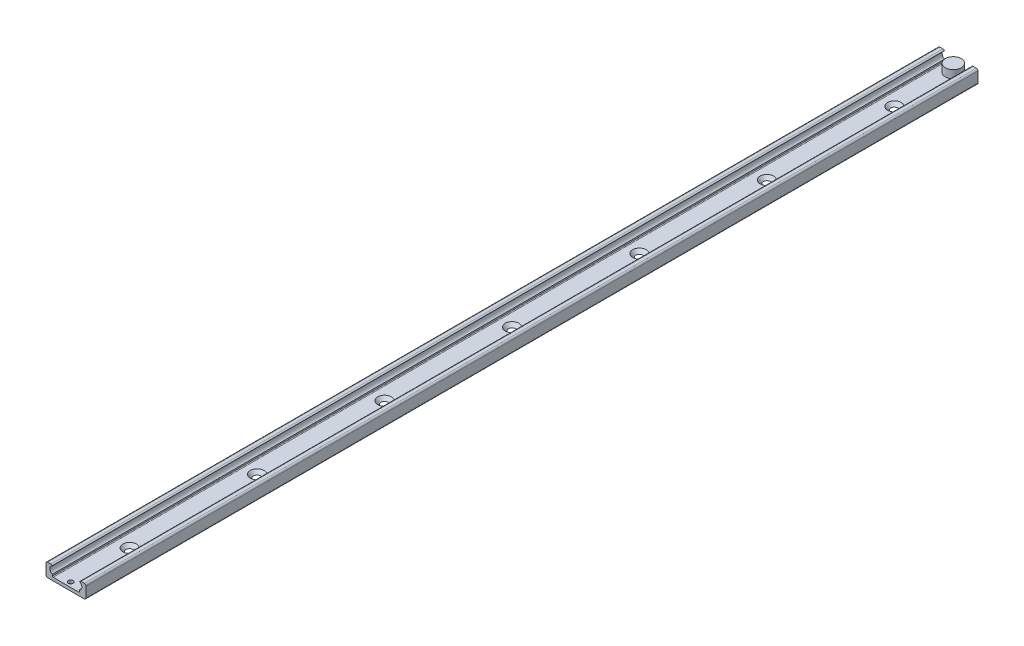
ISO-10303-21;
HEADER;
FILE_DESCRIPTION(('STEP AP214'),'2;1');
FILE_NAME('part.step','',(''),(''),'','','');
FILE_SCHEMA(('AUTOMOTIVE_DESIGN { 1 0 10303 214 1 1 1 1 }'));
ENDSEC;
DATA;
#1=APPLICATION_CONTEXT('core data for automotive mechanical design processes');
#2=APPLICATION_PROTOCOL_DEFINITION('international standard','automotive_design',2000,#1);
#3=PRODUCT_CONTEXT('',#1,'mechanical');
#4=PRODUCT('Part','Part','',(#3));
#5=PRODUCT_RELATED_PRODUCT_CATEGORY('part','',(#4));
#6=PRODUCT_DEFINITION_FORMATION('','',#4);
#7=PRODUCT_DEFINITION_CONTEXT('part definition',#1,'design');
#8=PRODUCT_DEFINITION('design','',#6,#7);
#9=PRODUCT_DEFINITION_SHAPE('','',#8);
#10=(LENGTH_UNIT() NAMED_UNIT(*) SI_UNIT(.MILLI.,.METRE.));
#11=(NAMED_UNIT(*) PLANE_ANGLE_UNIT() SI_UNIT($,.RADIAN.));
#12=(NAMED_UNIT(*) SI_UNIT($,.STERADIAN.) SOLID_ANGLE_UNIT());
#13=UNCERTAINTY_MEASURE_WITH_UNIT(LENGTH_MEASURE(1.E-05),#10,'distance_accuracy_value','');
#14=(GEOMETRIC_REPRESENTATION_CONTEXT(3) GLOBAL_UNCERTAINTY_ASSIGNED_CONTEXT((#13)) GLOBAL_UNIT_ASSIGNED_CONTEXT((#10,
#11,#12)) REPRESENTATION_CONTEXT('',''));
#15=CARTESIAN_POINT('',(0.,0.,0.));
#16=DIRECTION('',(0.,0.,1.));
#17=DIRECTION('',(1.,0.,0.));
#18=AXIS2_PLACEMENT_3D('',#15,#16,#17);
#19=CARTESIAN_POINT('',(-12.5,0.,0.));
#20=DIRECTION('',(0.,-1.,0.));
#21=DIRECTION('',(0.,0.,-1.));
#22=AXIS2_PLACEMENT_3D('',#19,#20,#21);
#23=PLANE('',#22);
#24=CARTESIAN_POINT('',(0.,0.,557.));
#25=DIRECTION('',(0.,1.,0.));
#26=DIRECTION('',(0.,0.,1.));
#27=AXIS2_PLACEMENT_3D('',#24,#25,#26);
#28=CIRCLE('',#27,1.5);
#29=CARTESIAN_POINT('',(0.,0.,558.5));
#30=VERTEX_POINT('',#29);
#31=EDGE_CURVE('E369',#30,#30,#28,.T.);
#32=ORIENTED_EDGE('',*,*,#31,.T.);
#33=EDGE_LOOP('',(#32));
#34=FACE_BOUND('',#33,.T.);
#35=DIRECTION('',(1.,0.,0.));
#36=VECTOR('',#35,1.);
#37=CARTESIAN_POINT('',(-14.285299108863,0.,560.));
#38=LINE('',#37,#36);
#39=CARTESIAN_POINT('',(-11.5000000000008,0.,560.));
#40=VERTEX_POINT('',#39);
#41=CARTESIAN_POINT('',(11.5000000000008,0.,560.));
#42=VERTEX_POINT('',#41);
#43=EDGE_CURVE('E367',#40,#42,#38,.T.);
#44=ORIENTED_EDGE('',*,*,#43,.F.);
#45=DIRECTION('',(0.,0.,1.));
#46=VECTOR('',#45,1.);
#47=CARTESIAN_POINT('',(-11.5000000000008,0.,0.));
#48=LINE('',#47,#46);
#49=CARTESIAN_POINT('',(-11.5000000000008,0.,0.));
#50=VERTEX_POINT('',#49);
#51=EDGE_CURVE('E232',#40,#50,#48,.F.);
#52=ORIENTED_EDGE('',*,*,#51,.T.);
#53=DIRECTION('',(1.,0.,0.));
#54=VECTOR('',#53,1.);
#55=CARTESIAN_POINT('',(-12.5,0.,0.));
#56=LINE('',#55,#54);
#57=CARTESIAN_POINT('',(11.5000000000008,0.,0.));
#58=VERTEX_POINT('',#57);
#59=EDGE_CURVE('E217',#50,#58,#56,.T.);
#60=ORIENTED_EDGE('',*,*,#59,.T.);
#61=DIRECTION('',(0.,0.,1.));
#62=VECTOR('',#61,1.);
#63=CARTESIAN_POINT('',(11.5000000000008,0.,0.));
#64=LINE('',#63,#62);
#65=EDGE_CURVE('E229',#58,#42,#64,.T.);
#66=ORIENTED_EDGE('',*,*,#65,.T.);
#67=EDGE_LOOP('',(#44,#52,#60,#66));
#68=FACE_BOUND('',#67,.T.);
#69=CARTESIAN_POINT('',(0.,0.,40.));
#70=DIRECTION('',(0.,1.,0.));
#71=DIRECTION('',(0.,0.,1.));
#72=AXIS2_PLACEMENT_3D('',#69,#70,#71);
#73=CIRCLE('',#72,2.25000000000002);
#74=CARTESIAN_POINT('',(0.,0.,42.25));
#75=VERTEX_POINT('',#74);
#76=EDGE_CURVE('E336',#75,#75,#73,.T.);
#77=ORIENTED_EDGE('',*,*,#76,.T.);
#78=EDGE_LOOP('',(#77));
#79=FACE_BOUND('',#78,.T.);
#80=CARTESIAN_POINT('',(0.,0.,120.));
#81=DIRECTION('',(0.,1.,0.));
#82=DIRECTION('',(0.,0.,1.));
#83=AXIS2_PLACEMENT_3D('',#80,#81,#82);
#84=CIRCLE('',#83,2.25000000000002);
#85=CARTESIAN_POINT('',(0.,0.,122.25));
#86=VERTEX_POINT('',#85);
#87=EDGE_CURVE('E300',#86,#86,#84,.T.);
#88=ORIENTED_EDGE('',*,*,#87,.T.);
#89=EDGE_LOOP('',(#88));
#90=FACE_BOUND('',#89,.T.);
#91=CARTESIAN_POINT('',(0.,0.,200.));
#92=DIRECTION('',(0.,1.,0.));
#93=DIRECTION('',(0.,0.,1.));
#94=AXIS2_PLACEMENT_3D('',#91,#92,#93);
#95=CIRCLE('',#94,2.25000000000002);
#96=CARTESIAN_POINT('',(0.,0.,202.25));
#97=VERTEX_POINT('',#96);
#98=EDGE_CURVE('E306',#97,#97,#95,.T.);
#99=ORIENTED_EDGE('',*,*,#98,.T.);
#100=EDGE_LOOP('',(#99));
#101=FACE_BOUND('',#100,.T.);
#102=CARTESIAN_POINT('',(0.,0.,280.));
#103=DIRECTION('',(0.,1.,0.));
#104=DIRECTION('',(0.,0.,1.));
#105=AXIS2_PLACEMENT_3D('',#102,#103,#104);
#106=CIRCLE('',#105,2.25000000000002);
#107=CARTESIAN_POINT('',(0.,0.,282.25));
#108=VERTEX_POINT('',#107);
#109=EDGE_CURVE('E312',#108,#108,#106,.T.);
#110=ORIENTED_EDGE('',*,*,#109,.T.);
#111=EDGE_LOOP('',(#110));
#112=FACE_BOUND('',#111,.T.);
#113=CARTESIAN_POINT('',(0.,0.,360.));
#114=DIRECTION('',(0.,1.,0.));
#115=DIRECTION('',(0.,0.,1.));
#116=AXIS2_PLACEMENT_3D('',#113,#114,#115);
#117=CIRCLE('',#116,2.25000000000002);
#118=CARTESIAN_POINT('',(0.,0.,362.25));
#119=VERTEX_POINT('',#118);
#120=EDGE_CURVE('E318',#119,#119,#117,.T.);
#121=ORIENTED_EDGE('',*,*,#120,.T.);
#122=EDGE_LOOP('',(#121));
#123=FACE_BOUND('',#122,.T.);
#124=CARTESIAN_POINT('',(0.,0.,440.));
#125=DIRECTION('',(0.,1.,0.));
#126=DIRECTION('',(0.,0.,1.));
#127=AXIS2_PLACEMENT_3D('',#124,#125,#126);
#128=CIRCLE('',#127,2.25000000000002);
#129=CARTESIAN_POINT('',(0.,0.,442.25));
#130=VERTEX_POINT('',#129);
#131=EDGE_CURVE('E324',#130,#130,#128,.T.);
#132=ORIENTED_EDGE('',*,*,#131,.T.);
#133=EDGE_LOOP('',(#132));
#134=FACE_BOUND('',#133,.T.);
#135=CARTESIAN_POINT('',(0.,0.,520.));
#136=DIRECTION('',(0.,1.,0.));
#137=DIRECTION('',(0.,0.,1.));
#138=AXIS2_PLACEMENT_3D('',#135,#136,#137);
#139=CIRCLE('',#138,2.25000000000002);
#140=CARTESIAN_POINT('',(0.,0.,522.25));
#141=VERTEX_POINT('',#140);
#142=EDGE_CURVE('E330',#141,#141,#139,.T.);
#143=ORIENTED_EDGE('',*,*,#142,.T.);
#144=EDGE_LOOP('',(#143));
#145=FACE_BOUND('',#144,.T.);
#146=ADVANCED_FACE('F39',(#34,#68,#79,#90,#101,#112,#123,#134,#145),#23,.T.);
#147=CARTESIAN_POINT('',(9.5,7.5,0.));
#148=DIRECTION('',(0.,0.,1.));
#149=DIRECTION('',(1.,0.,0.));
#150=AXIS2_PLACEMENT_3D('',#147,#148,#149);
#151=CYLINDRICAL_SURFACE('',#150,1.);
#152=CARTESIAN_POINT('',(9.5,7.5,560.));
#153=DIRECTION('',(0.,0.,-1.));
#154=DIRECTION('',(-1.,0.,0.));
#155=AXIS2_PLACEMENT_3D('',#152,#153,#154);
#156=CIRCLE('',#155,1.);
#157=CARTESIAN_POINT('',(9.5,8.5,560.));
#158=VERTEX_POINT('',#157);
#159=CARTESIAN_POINT('',(8.60359240331616,7.94323066298205,560.));
#160=VERTEX_POINT('',#159);
#161=EDGE_CURVE('E342',#158,#160,#156,.F.);
#162=ORIENTED_EDGE('',*,*,#161,.F.);
#163=DIRECTION('',(0.,0.,1.));
#164=VECTOR('',#163,1.);
#165=CARTESIAN_POINT('',(9.5,8.5,0.));
#166=LINE('',#165,#164);
#167=CARTESIAN_POINT('',(9.5,8.5,0.));
#168=VERTEX_POINT('',#167);
#169=EDGE_CURVE('E188',#168,#158,#166,.T.);
#170=ORIENTED_EDGE('',*,*,#169,.F.);
#171=CARTESIAN_POINT('',(9.5,7.5,0.));
#172=DIRECTION('',(0.,0.,1.));
#173=DIRECTION('',(1.,0.,0.));
#174=AXIS2_PLACEMENT_3D('',#171,#172,#173);
#175=CIRCLE('',#174,1.);
#176=CARTESIAN_POINT('',(8.60359240331616,7.94323066298205,0.));
#177=VERTEX_POINT('',#176);
#178=EDGE_CURVE('E290',#168,#177,#175,.T.);
#179=ORIENTED_EDGE('',*,*,#178,.T.);
#180=DIRECTION('',(0.,0.,1.));
#181=VECTOR('',#180,1.);
#182=CARTESIAN_POINT('',(8.60359240331616,7.94323066298205,0.));
#183=LINE('',#182,#181);
#184=EDGE_CURVE('E248',#177,#160,#183,.T.);
#185=ORIENTED_EDGE('',*,*,#184,.T.);
#186=EDGE_LOOP('',(#162,#170,#179,#185));
#187=FACE_BOUND('',#186,.T.);
#188=ADVANCED_FACE('F425',(#187),#151,.T.);
#189=CARTESIAN_POINT('',(12.5,8.5,0.));
#190=DIRECTION('',(0.,1.,0.));
#191=DIRECTION('',(0.,0.,1.));
#192=AXIS2_PLACEMENT_3D('',#189,#190,#191);
#193=PLANE('',#192);
#194=DIRECTION('',(-1.,0.,0.));
#195=VECTOR('',#194,1.);
#196=CARTESIAN_POINT('',(-14.285299108863,8.5,560.));
#197=LINE('',#196,#195);
#198=CARTESIAN_POINT('',(11.5000000000008,8.5,560.));
#199=VERTEX_POINT('',#198);
#200=EDGE_CURVE('E172',#199,#158,#197,.T.);
#201=ORIENTED_EDGE('',*,*,#200,.F.);
#202=DIRECTION('',(0.,0.,1.));
#203=VECTOR('',#202,1.);
#204=CARTESIAN_POINT('',(11.5000000000008,8.5,0.));
#205=LINE('',#204,#203);
#206=CARTESIAN_POINT('',(11.5000000000008,8.5,0.));
#207=VERTEX_POINT('',#206);
#208=EDGE_CURVE('E185',#199,#207,#205,.F.);
#209=ORIENTED_EDGE('',*,*,#208,.T.);
#210=DIRECTION('',(-1.,0.,0.));
#211=VECTOR('',#210,1.);
#212=CARTESIAN_POINT('',(12.5,8.5,0.));
#213=LINE('',#212,#211);
#214=EDGE_CURVE('E252',#207,#168,#213,.T.);
#215=ORIENTED_EDGE('',*,*,#214,.T.);
#216=ORIENTED_EDGE('',*,*,#169,.T.);
#217=EDGE_LOOP('',(#201,#209,#215,#216));
#218=FACE_BOUND('',#217,.T.);
#219=ADVANCED_FACE('F184',(#218),#193,.T.);
#220=CARTESIAN_POINT('',(12.5,0.,0.));
#221=DIRECTION('',(1.,0.,0.));
#222=DIRECTION('',(0.,0.,-1.));
#223=AXIS2_PLACEMENT_3D('',#220,#221,#222);
#224=PLANE('',#223);
#225=DIRECTION('',(0.,1.,0.));
#226=VECTOR('',#225,1.);
#227=CARTESIAN_POINT('',(12.5,0.,560.));
#228=LINE('',#227,#226);
#229=CARTESIAN_POINT('',(12.5,0.999999999999222,560.));
#230=VERTEX_POINT('',#229);
#231=CARTESIAN_POINT('',(12.5,7.50000000000078,560.));
#232=VERTEX_POINT('',#231);
#233=EDGE_CURVE('E175',#230,#232,#228,.T.);
#234=ORIENTED_EDGE('',*,*,#233,.F.);
#235=DIRECTION('',(0.,0.,1.));
#236=VECTOR('',#235,1.);
#237=CARTESIAN_POINT('',(12.5,0.999999999999222,0.));
#238=LINE('',#237,#236);
#239=CARTESIAN_POINT('',(12.5,0.999999999999222,0.));
#240=VERTEX_POINT('',#239);
#241=EDGE_CURVE('E223',#230,#240,#238,.F.);
#242=ORIENTED_EDGE('',*,*,#241,.T.);
#243=DIRECTION('',(0.,1.,0.));
#244=VECTOR('',#243,1.);
#245=CARTESIAN_POINT('',(12.5,0.,0.));
#246=LINE('',#245,#244);
#247=CARTESIAN_POINT('',(12.5,7.50000000000078,0.));
#248=VERTEX_POINT('',#247);
#249=EDGE_CURVE('E266',#240,#248,#246,.T.);
#250=ORIENTED_EDGE('',*,*,#249,.T.);
#251=DIRECTION('',(0.,0.,1.));
#252=VECTOR('',#251,1.);
#253=CARTESIAN_POINT('',(12.5,7.50000000000078,0.));
#254=LINE('',#253,#252);
#255=EDGE_CURVE('E227',#248,#232,#254,.T.);
#256=ORIENTED_EDGE('',*,*,#255,.T.);
#257=EDGE_LOOP('',(#234,#242,#250,#256));
#258=FACE_BOUND('',#257,.T.);
#259=ADVANCED_FACE('F435',(#258),#224,.T.);
#260=CARTESIAN_POINT('',(-12.5,8.5,0.));
#261=DIRECTION('',(-1.,0.,0.));
#262=DIRECTION('',(0.,0.,1.));
#263=AXIS2_PLACEMENT_3D('',#260,#261,#262);
#264=PLANE('',#263);
#265=DIRECTION('',(0.,-1.,0.));
#266=VECTOR('',#265,1.);
#267=CARTESIAN_POINT('',(-12.5,8.5,560.));
#268=LINE('',#267,#266);
#269=CARTESIAN_POINT('',(-12.5,7.50000000000078,560.));
#270=VERTEX_POINT('',#269);
#271=CARTESIAN_POINT('',(-12.5,0.999999999999222,560.));
#272=VERTEX_POINT('',#271);
#273=EDGE_CURVE('E53',#270,#272,#268,.T.);
#274=ORIENTED_EDGE('',*,*,#273,.F.);
#275=DIRECTION('',(0.,0.,1.));
#276=VECTOR('',#275,1.);
#277=CARTESIAN_POINT('',(-12.5,7.50000000000078,0.));
#278=LINE('',#277,#276);
#279=CARTESIAN_POINT('',(-12.5,7.50000000000078,0.));
#280=VERTEX_POINT('',#279);
#281=EDGE_CURVE('E47',#270,#280,#278,.F.);
#282=ORIENTED_EDGE('',*,*,#281,.T.);
#283=DIRECTION('',(0.,-1.,0.));
#284=VECTOR('',#283,1.);
#285=CARTESIAN_POINT('',(-12.5,8.5,0.));
#286=LINE('',#285,#284);
#287=CARTESIAN_POINT('',(-12.5,0.999999999999222,0.));
#288=VERTEX_POINT('',#287);
#289=EDGE_CURVE('E208',#280,#288,#286,.T.);
#290=ORIENTED_EDGE('',*,*,#289,.T.);
#291=DIRECTION('',(0.,0.,1.));
#292=VECTOR('',#291,1.);
#293=CARTESIAN_POINT('',(-12.5,0.999999999999222,0.));
#294=LINE('',#293,#292);
#295=EDGE_CURVE('E198',#288,#272,#294,.T.);
#296=ORIENTED_EDGE('',*,*,#295,.T.);
#297=EDGE_LOOP('',(#274,#282,#290,#296));
#298=FACE_BOUND('',#297,.T.);
#299=ADVANCED_FACE('F207',(#298),#264,.T.);
#300=CARTESIAN_POINT('',(-9.5,8.5,0.));
#301=DIRECTION('',(0.,1.,0.));
#302=DIRECTION('',(0.,0.,1.));
#303=AXIS2_PLACEMENT_3D('',#300,#301,#302);
#304=PLANE('',#303);
#305=CARTESIAN_POINT('',(-9.5,8.5,560.));
#306=VERTEX_POINT('',#305);
#307=CARTESIAN_POINT('',(-11.5000000000008,8.5,560.));
#308=VERTEX_POINT('',#307);
#309=EDGE_CURVE('E189',#306,#308,#197,.T.);
#310=ORIENTED_EDGE('',*,*,#309,.F.);
#311=DIRECTION('',(0.,0.,1.));
#312=VECTOR('',#311,1.);
#313=CARTESIAN_POINT('',(-9.5,8.5,0.));
#314=LINE('',#313,#312);
#315=CARTESIAN_POINT('',(-9.5,8.5,0.));
#316=VERTEX_POINT('',#315);
#317=EDGE_CURVE('E261',#316,#306,#314,.T.);
#318=ORIENTED_EDGE('',*,*,#317,.F.);
#319=DIRECTION('',(-1.,0.,0.));
#320=VECTOR('',#319,1.);
#321=CARTESIAN_POINT('',(-9.5,8.5,0.));
#322=LINE('',#321,#320);
#323=CARTESIAN_POINT('',(-11.5000000000008,8.5,0.));
#324=VERTEX_POINT('',#323);
#325=EDGE_CURVE('E218',#316,#324,#322,.T.);
#326=ORIENTED_EDGE('',*,*,#325,.T.);
#327=DIRECTION('',(0.,0.,1.));
#328=VECTOR('',#327,1.);
#329=CARTESIAN_POINT('',(-11.5000000000008,8.5,0.));
#330=LINE('',#329,#328);
#331=EDGE_CURVE('E194',#324,#308,#330,.T.);
#332=ORIENTED_EDGE('',*,*,#331,.T.);
#333=EDGE_LOOP('',(#310,#318,#326,#332));
#334=FACE_BOUND('',#333,.T.);
#335=ADVANCED_FACE('F439',(#334),#304,.T.);
#336=CARTESIAN_POINT('',(-9.5,7.5,0.));
#337=DIRECTION('',(0.,0.,1.));
#338=DIRECTION('',(1.,0.,0.));
#339=AXIS2_PLACEMENT_3D('',#336,#337,#338);
#340=CYLINDRICAL_SURFACE('',#339,1.);
#341=CARTESIAN_POINT('',(-9.5,7.5,560.));
#342=DIRECTION('',(0.,0.,-1.));
#343=DIRECTION('',(-1.,0.,0.));
#344=AXIS2_PLACEMENT_3D('',#341,#342,#343);
#345=CIRCLE('',#344,1.);
#346=CARTESIAN_POINT('',(-8.60359240331616,7.94323066298205,560.));
#347=VERTEX_POINT('',#346);
#348=EDGE_CURVE('E344',#347,#306,#345,.F.);
#349=ORIENTED_EDGE('',*,*,#348,.F.);
#350=DIRECTION('',(0.,0.,1.));
#351=VECTOR('',#350,1.);
#352=CARTESIAN_POINT('',(-8.60359240331616,7.94323066298205,0.));
#353=LINE('',#352,#351);
#354=CARTESIAN_POINT('',(-8.60359240331616,7.94323066298205,0.));
#355=VERTEX_POINT('',#354);
#356=EDGE_CURVE('E258',#355,#347,#353,.T.);
#357=ORIENTED_EDGE('',*,*,#356,.F.);
#358=CARTESIAN_POINT('',(-9.5,7.5,0.));
#359=DIRECTION('',(0.,0.,1.));
#360=DIRECTION('',(1.,0.,0.));
#361=AXIS2_PLACEMENT_3D('',#358,#359,#360);
#362=CIRCLE('',#361,1.);
#363=EDGE_CURVE('E272',#355,#316,#362,.T.);
#364=ORIENTED_EDGE('',*,*,#363,.T.);
#365=ORIENTED_EDGE('',*,*,#317,.T.);
#366=EDGE_LOOP('',(#349,#357,#364,#365));
#367=FACE_BOUND('',#366,.T.);
#368=ADVANCED_FACE('F442',(#367),#340,.T.);
#369=CARTESIAN_POINT('',(-7.5,5.7,0.));
#370=DIRECTION('',(0.,0.,1.));
#371=DIRECTION('',(1.,0.,0.));
#372=AXIS2_PLACEMENT_3D('',#369,#370,#371);
#373=CYLINDRICAL_SURFACE('',#372,2.5);
#374=CARTESIAN_POINT('',(-7.5,5.7,560.));
#375=DIRECTION('',(0.,0.,-1.));
#376=DIRECTION('',(-1.,0.,0.));
#377=AXIS2_PLACEMENT_3D('',#374,#375,#376);
#378=CIRCLE('',#377,2.5);
#379=CARTESIAN_POINT('',(-8.5,3.40871215252208,560.));
#380=VERTEX_POINT('',#379);
#381=EDGE_CURVE('E346',#380,#347,#378,.T.);
#382=ORIENTED_EDGE('',*,*,#381,.F.);
#383=DIRECTION('',(0.,0.,1.));
#384=VECTOR('',#383,1.);
#385=CARTESIAN_POINT('',(-8.5,3.40871215252208,0.));
#386=LINE('',#385,#384);
#387=CARTESIAN_POINT('',(-8.5,3.40871215252208,0.));
#388=VERTEX_POINT('',#387);
#389=EDGE_CURVE('E255',#388,#380,#386,.T.);
#390=ORIENTED_EDGE('',*,*,#389,.F.);
#391=CARTESIAN_POINT('',(-7.5,5.7,0.));
#392=DIRECTION('',(0.,0.,-1.));
#393=DIRECTION('',(-1.,0.,0.));
#394=AXIS2_PLACEMENT_3D('',#391,#392,#393);
#395=CIRCLE('',#394,2.5);
#396=EDGE_CURVE('E275',#388,#355,#395,.T.);
#397=ORIENTED_EDGE('',*,*,#396,.T.);
#398=ORIENTED_EDGE('',*,*,#356,.T.);
#399=EDGE_LOOP('',(#382,#390,#397,#398));
#400=FACE_BOUND('',#399,.T.);
#401=ADVANCED_FACE('F446',(#400),#373,.F.);
#402=CARTESIAN_POINT('',(-8.5,2.,0.));
#403=DIRECTION('',(1.,0.,0.));
#404=DIRECTION('',(0.,0.,-1.));
#405=AXIS2_PLACEMENT_3D('',#402,#403,#404);
#406=PLANE('',#405);
#407=DIRECTION('',(0.,1.,0.));
#408=VECTOR('',#407,1.);
#409=CARTESIAN_POINT('',(-8.5,2.,560.));
#410=LINE('',#409,#408);
#411=CARTESIAN_POINT('',(-8.5,2.49999999999991,560.));
#412=VERTEX_POINT('',#411);
#413=EDGE_CURVE('E348',#412,#380,#410,.T.);
#414=ORIENTED_EDGE('',*,*,#413,.F.);
#415=DIRECTION('',(0.,0.,1.));
#416=VECTOR('',#415,1.);
#417=CARTESIAN_POINT('',(-8.5,2.49999999999991,0.));
#418=LINE('',#417,#416);
#419=CARTESIAN_POINT('',(-8.5,2.49999999999991,0.));
#420=VERTEX_POINT('',#419);
#421=EDGE_CURVE('E241',#412,#420,#418,.F.);
#422=ORIENTED_EDGE('',*,*,#421,.T.);
#423=DIRECTION('',(0.,1.,0.));
#424=VECTOR('',#423,1.);
#425=CARTESIAN_POINT('',(-8.5,2.,0.));
#426=LINE('',#425,#424);
#427=EDGE_CURVE('E278',#420,#388,#426,.T.);
#428=ORIENTED_EDGE('',*,*,#427,.T.);
#429=ORIENTED_EDGE('',*,*,#389,.T.);
#430=EDGE_LOOP('',(#414,#422,#428,#429));
#431=FACE_BOUND('',#430,.T.);
#432=ADVANCED_FACE('F388',(#431),#406,.T.);
#433=CARTESIAN_POINT('',(8.5,2.,0.));
#434=DIRECTION('',(0.,1.,0.));
#435=DIRECTION('',(0.,0.,1.));
#436=AXIS2_PLACEMENT_3D('',#433,#434,#435);
#437=PLANE('',#436);
#438=CARTESIAN_POINT('',(0.,2.,557.));
#439=DIRECTION('',(0.,1.,0.));
#440=DIRECTION('',(0.,0.,1.));
#441=AXIS2_PLACEMENT_3D('',#438,#439,#440);
#442=CIRCLE('',#441,1.5);
#443=CARTESIAN_POINT('',(0.,2.,558.5));
#444=VERTEX_POINT('',#443);
#445=EDGE_CURVE('E370',#444,#444,#442,.T.);
#446=ORIENTED_EDGE('',*,*,#445,.F.);
#447=EDGE_LOOP('',(#446));
#448=FACE_BOUND('',#447,.T.);
#449=DIRECTION('',(-1.,0.,0.));
#450=VECTOR('',#449,1.);
#451=CARTESIAN_POINT('',(8.5,2.,560.));
#452=LINE('',#451,#450);
#453=CARTESIAN_POINT('',(8.00000000000009,2.,560.));
#454=VERTEX_POINT('',#453);
#455=CARTESIAN_POINT('',(-8.00000000000008,2.,560.));
#456=VERTEX_POINT('',#455);
#457=EDGE_CURVE('E355',#454,#456,#452,.T.);
#458=ORIENTED_EDGE('',*,*,#457,.F.);
#459=DIRECTION('',(0.,0.,1.));
#460=VECTOR('',#459,1.);
#461=CARTESIAN_POINT('',(8.00000000000009,2.,0.));
#462=LINE('',#461,#460);
#463=CARTESIAN_POINT('',(8.00000000000009,2.,0.));
#464=VERTEX_POINT('',#463);
#465=EDGE_CURVE('E246',#454,#464,#462,.F.);
#466=ORIENTED_EDGE('',*,*,#465,.T.);
#467=DIRECTION('',(-1.,0.,0.));
#468=VECTOR('',#467,1.);
#469=CARTESIAN_POINT('',(8.5,2.,0.));
#470=LINE('',#469,#468);
#471=CARTESIAN_POINT('',(4.,2.,0.));
#472=VERTEX_POINT('',#471);
#473=EDGE_CURVE('E280',#464,#472,#470,.T.);
#474=ORIENTED_EDGE('',*,*,#473,.T.);
#475=CARTESIAN_POINT('',(0.,2.,3.));
#476=DIRECTION('',(0.,1.,0.));
#477=DIRECTION('',(0.,0.,1.));
#478=AXIS2_PLACEMENT_3D('',#475,#476,#477);
#479=CIRCLE('',#478,5.);
#480=CARTESIAN_POINT('',(-4.,2.,0.));
#481=VERTEX_POINT('',#480);
#482=EDGE_CURVE('E297',#481,#472,#479,.T.);
#483=ORIENTED_EDGE('',*,*,#482,.F.);
#484=CARTESIAN_POINT('',(-8.00000000000009,2.,0.));
#485=VERTEX_POINT('',#484);
#486=EDGE_CURVE('E283',#481,#485,#470,.T.);
#487=ORIENTED_EDGE('',*,*,#486,.T.);
#488=DIRECTION('',(0.,0.,1.));
#489=VECTOR('',#488,1.);
#490=CARTESIAN_POINT('',(-8.00000000000009,2.,720.));
#491=LINE('',#490,#489);
#492=EDGE_CURVE('E243',#485,#456,#491,.T.);
#493=ORIENTED_EDGE('',*,*,#492,.T.);
#494=EDGE_LOOP('',(#458,#466,#474,#483,#487,#493));
#495=FACE_BOUND('',#494,.T.);
#496=CARTESIAN_POINT('',(0.,2.,40.));
#497=DIRECTION('',(0.,1.,0.));
#498=DIRECTION('',(0.,0.,1.));
#499=AXIS2_PLACEMENT_3D('',#496,#497,#498);
#500=CIRCLE('',#499,4.25000000000001);
#501=CARTESIAN_POINT('',(0.,2.,44.25));
#502=VERTEX_POINT('',#501);
#503=EDGE_CURVE('E339',#502,#502,#500,.T.);
#504=ORIENTED_EDGE('',*,*,#503,.F.);
#505=EDGE_LOOP('',(#504));
#506=FACE_BOUND('',#505,.T.);
#507=CARTESIAN_POINT('',(0.,2.,520.));
#508=DIRECTION('',(0.,1.,0.));
#509=DIRECTION('',(0.,0.,1.));
#510=AXIS2_PLACEMENT_3D('',#507,#508,#509);
#511=CIRCLE('',#510,4.25000000000001);
#512=CARTESIAN_POINT('',(0.,2.,524.25));
#513=VERTEX_POINT('',#512);
#514=EDGE_CURVE('E333',#513,#513,#511,.T.);
#515=ORIENTED_EDGE('',*,*,#514,.F.);
#516=EDGE_LOOP('',(#515));
#517=FACE_BOUND('',#516,.T.);
#518=CARTESIAN_POINT('',(0.,2.,440.));
#519=DIRECTION('',(0.,1.,0.));
#520=DIRECTION('',(0.,0.,1.));
#521=AXIS2_PLACEMENT_3D('',#518,#519,#520);
#522=CIRCLE('',#521,4.25000000000001);
#523=CARTESIAN_POINT('',(0.,2.,444.25));
#524=VERTEX_POINT('',#523);
#525=EDGE_CURVE('E327',#524,#524,#522,.T.);
#526=ORIENTED_EDGE('',*,*,#525,.F.);
#527=EDGE_LOOP('',(#526));
#528=FACE_BOUND('',#527,.T.);
#529=CARTESIAN_POINT('',(0.,2.,360.));
#530=DIRECTION('',(0.,1.,0.));
#531=DIRECTION('',(0.,0.,1.));
#532=AXIS2_PLACEMENT_3D('',#529,#530,#531);
#533=CIRCLE('',#532,4.25000000000001);
#534=CARTESIAN_POINT('',(0.,2.,364.25));
#535=VERTEX_POINT('',#534);
#536=EDGE_CURVE('E321',#535,#535,#533,.T.);
#537=ORIENTED_EDGE('',*,*,#536,.F.);
#538=EDGE_LOOP('',(#537));
#539=FACE_BOUND('',#538,.T.);
#540=CARTESIAN_POINT('',(0.,2.,280.));
#541=DIRECTION('',(0.,1.,0.));
#542=DIRECTION('',(0.,0.,1.));
#543=AXIS2_PLACEMENT_3D('',#540,#541,#542);
#544=CIRCLE('',#543,4.25000000000001);
#545=CARTESIAN_POINT('',(0.,2.,284.25));
#546=VERTEX_POINT('',#545);
#547=EDGE_CURVE('E315',#546,#546,#544,.T.);
#548=ORIENTED_EDGE('',*,*,#547,.F.);
#549=EDGE_LOOP('',(#548));
#550=FACE_BOUND('',#549,.T.);
#551=CARTESIAN_POINT('',(0.,2.,200.));
#552=DIRECTION('',(0.,1.,0.));
#553=DIRECTION('',(0.,0.,1.));
#554=AXIS2_PLACEMENT_3D('',#551,#552,#553);
#555=CIRCLE('',#554,4.25000000000001);
#556=CARTESIAN_POINT('',(0.,2.,204.25));
#557=VERTEX_POINT('',#556);
#558=EDGE_CURVE('E309',#557,#557,#555,.T.);
#559=ORIENTED_EDGE('',*,*,#558,.F.);
#560=EDGE_LOOP('',(#559));
#561=FACE_BOUND('',#560,.T.);
#562=CARTESIAN_POINT('',(0.,2.,120.));
#563=DIRECTION('',(0.,1.,0.));
#564=DIRECTION('',(0.,0.,1.));
#565=AXIS2_PLACEMENT_3D('',#562,#563,#564);
#566=CIRCLE('',#565,4.25000000000001);
#567=CARTESIAN_POINT('',(0.,2.,124.25));
#568=VERTEX_POINT('',#567);
#569=EDGE_CURVE('E303',#568,#568,#566,.T.);
#570=ORIENTED_EDGE('',*,*,#569,.F.);
#571=EDGE_LOOP('',(#570));
#572=FACE_BOUND('',#571,.T.);
#573=ADVANCED_FACE('F384',(#448,#495,#506,#517,#528,#539,#550,#561,#572),#437,.T.);
#574=CARTESIAN_POINT('',(8.5,3.40871215252208,0.));
#575=DIRECTION('',(-1.,0.,0.));
#576=DIRECTION('',(0.,0.,1.));
#577=AXIS2_PLACEMENT_3D('',#574,#575,#576);
#578=PLANE('',#577);
#579=DIRECTION('',(0.,-1.,0.));
#580=VECTOR('',#579,1.);
#581=CARTESIAN_POINT('',(8.5,3.40871215252208,560.));
#582=LINE('',#581,#580);
#583=CARTESIAN_POINT('',(8.5,3.40871215252208,560.));
#584=VERTEX_POINT('',#583);
#585=CARTESIAN_POINT('',(8.5,2.49999999999991,560.));
#586=VERTEX_POINT('',#585);
#587=EDGE_CURVE('E357',#584,#586,#582,.T.);
#588=ORIENTED_EDGE('',*,*,#587,.F.);
#589=DIRECTION('',(0.,0.,1.));
#590=VECTOR('',#589,1.);
#591=CARTESIAN_POINT('',(8.5,3.40871215252208,0.));
#592=LINE('',#591,#590);
#593=CARTESIAN_POINT('',(8.5,3.40871215252208,0.));
#594=VERTEX_POINT('',#593);
#595=EDGE_CURVE('E251',#594,#584,#592,.T.);
#596=ORIENTED_EDGE('',*,*,#595,.F.);
#597=DIRECTION('',(0.,-1.,0.));
#598=VECTOR('',#597,1.);
#599=CARTESIAN_POINT('',(8.5,3.40871215252208,0.));
#600=LINE('',#599,#598);
#601=CARTESIAN_POINT('',(8.5,2.49999999999991,0.));
#602=VERTEX_POINT('',#601);
#603=EDGE_CURVE('E284',#594,#602,#600,.T.);
#604=ORIENTED_EDGE('',*,*,#603,.T.);
#605=DIRECTION('',(0.,0.,1.));
#606=VECTOR('',#605,1.);
#607=CARTESIAN_POINT('',(8.5,2.49999999999991,720.));
#608=LINE('',#607,#606);
#609=EDGE_CURVE('E238',#602,#586,#608,.T.);
#610=ORIENTED_EDGE('',*,*,#609,.T.);
#611=EDGE_LOOP('',(#588,#596,#604,#610));
#612=FACE_BOUND('',#611,.T.);
#613=ADVANCED_FACE('F387',(#612),#578,.T.);
#614=CARTESIAN_POINT('',(7.5,5.7,0.));
#615=DIRECTION('',(0.,0.,1.));
#616=DIRECTION('',(1.,0.,0.));
#617=AXIS2_PLACEMENT_3D('',#614,#615,#616);
#618=CYLINDRICAL_SURFACE('',#617,2.5);
#619=CARTESIAN_POINT('',(7.5,5.7,560.));
#620=DIRECTION('',(0.,0.,-1.));
#621=DIRECTION('',(-1.,0.,0.));
#622=AXIS2_PLACEMENT_3D('',#619,#620,#621);
#623=CIRCLE('',#622,2.5);
#624=EDGE_CURVE('E350',#160,#584,#623,.T.);
#625=ORIENTED_EDGE('',*,*,#624,.F.);
#626=ORIENTED_EDGE('',*,*,#184,.F.);
#627=CARTESIAN_POINT('',(7.5,5.7,0.));
#628=DIRECTION('',(0.,0.,-1.));
#629=DIRECTION('',(-1.,0.,0.));
#630=AXIS2_PLACEMENT_3D('',#627,#628,#629);
#631=CIRCLE('',#630,2.5);
#632=EDGE_CURVE('E287',#177,#594,#631,.T.);
#633=ORIENTED_EDGE('',*,*,#632,.T.);
#634=ORIENTED_EDGE('',*,*,#595,.T.);
#635=EDGE_LOOP('',(#625,#626,#633,#634));
#636=FACE_BOUND('',#635,.T.);
#637=ADVANCED_FACE('F456',(#636),#618,.F.);
#638=CARTESIAN_POINT('',(9.5,7.5,0.));
#639=DIRECTION('',(0.,0.,1.));
#640=DIRECTION('',(1.,0.,0.));
#641=AXIS2_PLACEMENT_3D('',#638,#639,#640);
#642=PLANE('',#641);
#643=ORIENTED_EDGE('',*,*,#249,.F.);
#644=CARTESIAN_POINT('',(11.5000000000008,0.999999999999222,0.));
#645=DIRECTION('',(0.,0.,1.));
#646=DIRECTION('',(1.,0.,0.));
#647=AXIS2_PLACEMENT_3D('',#644,#645,#646);
#648=CIRCLE('',#647,0.999999999999222);
#649=EDGE_CURVE('E195',#240,#58,#648,.F.);
#650=ORIENTED_EDGE('',*,*,#649,.T.);
#651=ORIENTED_EDGE('',*,*,#59,.F.);
#652=CARTESIAN_POINT('',(-11.5000000000008,0.999999999999222,0.));
#653=DIRECTION('',(0.,0.,1.));
#654=DIRECTION('',(1.,0.,0.));
#655=AXIS2_PLACEMENT_3D('',#652,#653,#654);
#656=CIRCLE('',#655,0.999999999999222);
#657=EDGE_CURVE('E216',#50,#288,#656,.F.);
#658=ORIENTED_EDGE('',*,*,#657,.T.);
#659=ORIENTED_EDGE('',*,*,#289,.F.);
#660=CARTESIAN_POINT('',(-11.5000000000008,7.50000000000078,0.));
#661=DIRECTION('',(0.,0.,1.));
#662=DIRECTION('',(1.,0.,0.));
#663=AXIS2_PLACEMENT_3D('',#660,#661,#662);
#664=CIRCLE('',#663,0.999999999999222);
#665=EDGE_CURVE('E61',#280,#324,#664,.F.);
#666=ORIENTED_EDGE('',*,*,#665,.T.);
#667=ORIENTED_EDGE('',*,*,#325,.F.);
#668=ORIENTED_EDGE('',*,*,#363,.F.);
#669=ORIENTED_EDGE('',*,*,#396,.F.);
#670=ORIENTED_EDGE('',*,*,#427,.F.);
#671=CARTESIAN_POINT('',(-8.00000000000009,2.49999999999991,0.));
#672=DIRECTION('',(0.,0.,1.));
#673=DIRECTION('',(1.,0.,0.));
#674=AXIS2_PLACEMENT_3D('',#671,#672,#673);
#675=CIRCLE('',#674,0.49999999999991);
#676=EDGE_CURVE('E236',#420,#485,#675,.T.);
#677=ORIENTED_EDGE('',*,*,#676,.T.);
#678=ORIENTED_EDGE('',*,*,#486,.F.);
#679=EDGE_CURVE('E282',#472,#481,#470,.T.);
#680=ORIENTED_EDGE('',*,*,#679,.F.);
#681=ORIENTED_EDGE('',*,*,#473,.F.);
#682=CARTESIAN_POINT('',(8.00000000000009,2.49999999999991,0.));
#683=DIRECTION('',(0.,0.,1.));
#684=DIRECTION('',(1.,0.,0.));
#685=AXIS2_PLACEMENT_3D('',#682,#683,#684);
#686=CIRCLE('',#685,0.49999999999991);
#687=EDGE_CURVE('E234',#464,#602,#686,.T.);
#688=ORIENTED_EDGE('',*,*,#687,.T.);
#689=ORIENTED_EDGE('',*,*,#603,.F.);
#690=ORIENTED_EDGE('',*,*,#632,.F.);
#691=ORIENTED_EDGE('',*,*,#178,.F.);
#692=ORIENTED_EDGE('',*,*,#214,.F.);
#693=CARTESIAN_POINT('',(11.5000000000008,7.50000000000078,0.));
#694=DIRECTION('',(0.,0.,1.));
#695=DIRECTION('',(1.,0.,0.));
#696=AXIS2_PLACEMENT_3D('',#693,#694,#695);
#697=CIRCLE('',#696,0.999999999999222);
#698=EDGE_CURVE('E193',#207,#248,#697,.F.);
#699=ORIENTED_EDGE('',*,*,#698,.T.);
#700=EDGE_LOOP('',(#643,#650,#651,#658,#659,#666,#667,#668,#669,#670,#677,#678,#680,#681,#688,
#689,#690,#691,#692,#699));
#701=FACE_BOUND('',#700,.T.);
#702=ADVANCED_FACE('F213',(#701),#642,.F.);
#703=CARTESIAN_POINT('',(0.,2.,3.));
#704=DIRECTION('',(0.,1.,0.));
#705=DIRECTION('',(0.,0.,1.));
#706=AXIS2_PLACEMENT_3D('',#703,#704,#705);
#707=PLANE('',#706);
#708=EDGE_CURVE('E294',#472,#481,#479,.T.);
#709=ORIENTED_EDGE('',*,*,#708,.F.);
#710=ORIENTED_EDGE('',*,*,#679,.T.);
#711=EDGE_LOOP('',(#709,#710));
#712=FACE_BOUND('',#711,.T.);
#713=ADVANCED_FACE('F511',(#712),#707,.F.);
#714=CARTESIAN_POINT('',(0.,7.,3.));
#715=DIRECTION('',(0.,-1.,0.));
#716=DIRECTION('',(0.,0.,-1.));
#717=AXIS2_PLACEMENT_3D('',#714,#715,#716);
#718=CYLINDRICAL_SURFACE('',#717,5.);
#719=CARTESIAN_POINT('',(0.,7.,3.));
#720=DIRECTION('',(0.,1.,0.));
#721=DIRECTION('',(0.,0.,1.));
#722=AXIS2_PLACEMENT_3D('',#719,#720,#721);
#723=CIRCLE('',#722,5.);
#724=CARTESIAN_POINT('',(0.,7.,8.));
#725=VERTEX_POINT('',#724);
#726=EDGE_CURVE('E293',#725,#725,#723,.T.);
#727=ORIENTED_EDGE('',*,*,#726,.F.);
#728=EDGE_LOOP('',(#727));
#729=FACE_BOUND('',#728,.T.);
#730=ORIENTED_EDGE('',*,*,#708,.T.);
#731=ORIENTED_EDGE('',*,*,#482,.T.);
#732=EDGE_LOOP('',(#730,#731));
#733=FACE_BOUND('',#732,.T.);
#734=ADVANCED_FACE('F420',(#729,#733),#718,.T.);
#735=CARTESIAN_POINT('',(0.,7.,3.));
#736=DIRECTION('',(0.,1.,0.));
#737=DIRECTION('',(0.,0.,1.));
#738=AXIS2_PLACEMENT_3D('',#735,#736,#737);
#739=PLANE('',#738);
#740=ORIENTED_EDGE('',*,*,#726,.T.);
#741=EDGE_LOOP('',(#740));
#742=FACE_BOUND('',#741,.T.);
#743=ADVANCED_FACE('F410',(#742),#739,.T.);
#744=CARTESIAN_POINT('',(0.,2.,120.));
#745=DIRECTION('',(0.,1.,0.));
#746=DIRECTION('',(0.,0.,1.));
#747=AXIS2_PLACEMENT_3D('',#744,#745,#746);
#748=CONICAL_SURFACE('',#747,4.25000000000001,0.785398163397447);
#749=ORIENTED_EDGE('',*,*,#87,.F.);
#750=EDGE_LOOP('',(#749));
#751=FACE_BOUND('',#750,.T.);
#752=ORIENTED_EDGE('',*,*,#569,.T.);
#753=EDGE_LOOP('',(#752));
#754=FACE_BOUND('',#753,.T.);
#755=ADVANCED_FACE('F407',(#751,#754),#748,.F.);
#756=CARTESIAN_POINT('',(0.,2.,200.));
#757=DIRECTION('',(0.,1.,0.));
#758=DIRECTION('',(0.,0.,1.));
#759=AXIS2_PLACEMENT_3D('',#756,#757,#758);
#760=CONICAL_SURFACE('',#759,4.25000000000001,0.785398163397447);
#761=ORIENTED_EDGE('',*,*,#98,.F.);
#762=EDGE_LOOP('',(#761));
#763=FACE_BOUND('',#762,.T.);
#764=ORIENTED_EDGE('',*,*,#558,.T.);
#765=EDGE_LOOP('',(#764));
#766=FACE_BOUND('',#765,.T.);
#767=ADVANCED_FACE('F409',(#763,#766),#760,.F.);
#768=CARTESIAN_POINT('',(0.,2.,280.));
#769=DIRECTION('',(0.,1.,0.));
#770=DIRECTION('',(0.,0.,1.));
#771=AXIS2_PLACEMENT_3D('',#768,#769,#770);
#772=CONICAL_SURFACE('',#771,4.25000000000001,0.785398163397447);
#773=ORIENTED_EDGE('',*,*,#109,.F.);
#774=EDGE_LOOP('',(#773));
#775=FACE_BOUND('',#774,.T.);
#776=ORIENTED_EDGE('',*,*,#547,.T.);
#777=EDGE_LOOP('',(#776));
#778=FACE_BOUND('',#777,.T.);
#779=ADVANCED_FACE('F417',(#775,#778),#772,.F.);
#780=CARTESIAN_POINT('',(0.,2.,360.));
#781=DIRECTION('',(0.,1.,0.));
#782=DIRECTION('',(0.,0.,1.));
#783=AXIS2_PLACEMENT_3D('',#780,#781,#782);
#784=CONICAL_SURFACE('',#783,4.25000000000001,0.785398163397447);
#785=ORIENTED_EDGE('',*,*,#120,.F.);
#786=EDGE_LOOP('',(#785));
#787=FACE_BOUND('',#786,.T.);
#788=ORIENTED_EDGE('',*,*,#536,.T.);
#789=EDGE_LOOP('',(#788));
#790=FACE_BOUND('',#789,.T.);
#791=ADVANCED_FACE('F647',(#787,#790),#784,.F.);
#792=CARTESIAN_POINT('',(0.,2.,440.));
#793=DIRECTION('',(0.,1.,0.));
#794=DIRECTION('',(0.,0.,1.));
#795=AXIS2_PLACEMENT_3D('',#792,#793,#794);
#796=CONICAL_SURFACE('',#795,4.25000000000001,0.785398163397447);
#797=ORIENTED_EDGE('',*,*,#131,.F.);
#798=EDGE_LOOP('',(#797));
#799=FACE_BOUND('',#798,.T.);
#800=ORIENTED_EDGE('',*,*,#525,.T.);
#801=EDGE_LOOP('',(#800));
#802=FACE_BOUND('',#801,.T.);
#803=ADVANCED_FACE('F656',(#799,#802),#796,.F.);
#804=CARTESIAN_POINT('',(0.,2.,520.));
#805=DIRECTION('',(0.,1.,0.));
#806=DIRECTION('',(0.,0.,1.));
#807=AXIS2_PLACEMENT_3D('',#804,#805,#806);
#808=CONICAL_SURFACE('',#807,4.25000000000001,0.785398163397447);
#809=ORIENTED_EDGE('',*,*,#142,.F.);
#810=EDGE_LOOP('',(#809));
#811=FACE_BOUND('',#810,.T.);
#812=ORIENTED_EDGE('',*,*,#514,.T.);
#813=EDGE_LOOP('',(#812));
#814=FACE_BOUND('',#813,.T.);
#815=ADVANCED_FACE('F665',(#811,#814),#808,.F.);
#816=CARTESIAN_POINT('',(0.,2.,40.));
#817=DIRECTION('',(0.,1.,0.));
#818=DIRECTION('',(0.,0.,1.));
#819=AXIS2_PLACEMENT_3D('',#816,#817,#818);
#820=CONICAL_SURFACE('',#819,4.25000000000001,0.785398163397447);
#821=ORIENTED_EDGE('',*,*,#76,.F.);
#822=EDGE_LOOP('',(#821));
#823=FACE_BOUND('',#822,.T.);
#824=ORIENTED_EDGE('',*,*,#503,.T.);
#825=EDGE_LOOP('',(#824));
#826=FACE_BOUND('',#825,.T.);
#827=ADVANCED_FACE('F465',(#823,#826),#820,.F.);
#828=CARTESIAN_POINT('',(-8.00000000000009,2.49999999999991,0.));
#829=DIRECTION('',(0.,0.,-1.));
#830=DIRECTION('',(-1.,0.,0.));
#831=AXIS2_PLACEMENT_3D('',#828,#829,#830);
#832=CYLINDRICAL_SURFACE('',#831,0.49999999999991);
#833=ORIENTED_EDGE('',*,*,#421,.F.);
#834=CARTESIAN_POINT('',(-8.00000000000009,2.49999999999991,560.));
#835=DIRECTION('',(0.,0.,-1.));
#836=DIRECTION('',(-1.,0.,0.));
#837=AXIS2_PLACEMENT_3D('',#834,#835,#836);
#838=CIRCLE('',#837,0.49999999999991);
#839=EDGE_CURVE('E352',#412,#456,#838,.F.);
#840=ORIENTED_EDGE('',*,*,#839,.T.);
#841=ORIENTED_EDGE('',*,*,#492,.F.);
#842=ORIENTED_EDGE('',*,*,#676,.F.);
#843=EDGE_LOOP('',(#833,#840,#841,#842));
#844=FACE_BOUND('',#843,.T.);
#845=ADVANCED_FACE('F461',(#844),#832,.F.);
#846=CARTESIAN_POINT('',(8.00000000000009,2.49999999999991,0.));
#847=DIRECTION('',(0.,0.,-1.));
#848=DIRECTION('',(-1.,0.,0.));
#849=AXIS2_PLACEMENT_3D('',#846,#847,#848);
#850=CYLINDRICAL_SURFACE('',#849,0.49999999999991);
#851=ORIENTED_EDGE('',*,*,#465,.F.);
#852=CARTESIAN_POINT('',(8.00000000000009,2.49999999999991,560.));
#853=DIRECTION('',(0.,0.,-1.));
#854=DIRECTION('',(-1.,0.,0.));
#855=AXIS2_PLACEMENT_3D('',#852,#853,#854);
#856=CIRCLE('',#855,0.49999999999991);
#857=EDGE_CURVE('E359',#454,#586,#856,.F.);
#858=ORIENTED_EDGE('',*,*,#857,.T.);
#859=ORIENTED_EDGE('',*,*,#609,.F.);
#860=ORIENTED_EDGE('',*,*,#687,.F.);
#861=EDGE_LOOP('',(#851,#858,#859,#860));
#862=FACE_BOUND('',#861,.T.);
#863=ADVANCED_FACE('F464',(#862),#850,.F.);
#864=CARTESIAN_POINT('',(11.5000000000008,0.999999999999222,0.));
#865=DIRECTION('',(0.,0.,1.));
#866=DIRECTION('',(1.,0.,0.));
#867=AXIS2_PLACEMENT_3D('',#864,#865,#866);
#868=CYLINDRICAL_SURFACE('',#867,0.999999999999222);
#869=CARTESIAN_POINT('',(11.5000000000008,0.999999999999222,560.));
#870=DIRECTION('',(0.,0.,-1.));
#871=DIRECTION('',(-1.,0.,0.));
#872=AXIS2_PLACEMENT_3D('',#869,#870,#871);
#873=CIRCLE('',#872,0.999999999999222);
#874=EDGE_CURVE('E362',#42,#230,#873,.F.);
#875=ORIENTED_EDGE('',*,*,#874,.F.);
#876=ORIENTED_EDGE('',*,*,#65,.F.);
#877=ORIENTED_EDGE('',*,*,#649,.F.);
#878=ORIENTED_EDGE('',*,*,#241,.F.);
#879=EDGE_LOOP('',(#875,#876,#877,#878));
#880=FACE_BOUND('',#879,.T.);
#881=ADVANCED_FACE('F469',(#880),#868,.T.);
#882=CARTESIAN_POINT('',(11.5000000000008,7.50000000000078,0.));
#883=DIRECTION('',(0.,0.,1.));
#884=DIRECTION('',(1.,0.,0.));
#885=AXIS2_PLACEMENT_3D('',#882,#883,#884);
#886=CYLINDRICAL_SURFACE('',#885,0.999999999999222);
#887=CARTESIAN_POINT('',(11.5000000000008,7.50000000000078,560.));
#888=DIRECTION('',(0.,0.,-1.));
#889=DIRECTION('',(-1.,0.,0.));
#890=AXIS2_PLACEMENT_3D('',#887,#888,#889);
#891=CIRCLE('',#890,0.999999999999222);
#892=EDGE_CURVE('E169',#232,#199,#891,.F.);
#893=ORIENTED_EDGE('',*,*,#892,.F.);
#894=ORIENTED_EDGE('',*,*,#255,.F.);
#895=ORIENTED_EDGE('',*,*,#698,.F.);
#896=ORIENTED_EDGE('',*,*,#208,.F.);
#897=EDGE_LOOP('',(#893,#894,#895,#896));
#898=FACE_BOUND('',#897,.T.);
#899=ADVANCED_FACE('F192',(#898),#886,.T.);
#900=CARTESIAN_POINT('',(-11.5000000000008,7.50000000000078,0.));
#901=DIRECTION('',(0.,0.,1.));
#902=DIRECTION('',(1.,0.,0.));
#903=AXIS2_PLACEMENT_3D('',#900,#901,#902);
#904=CYLINDRICAL_SURFACE('',#903,0.999999999999222);
#905=CARTESIAN_POINT('',(-11.5000000000008,7.50000000000078,560.));
#906=DIRECTION('',(0.,0.,-1.));
#907=DIRECTION('',(-1.,0.,0.));
#908=AXIS2_PLACEMENT_3D('',#905,#906,#907);
#909=CIRCLE('',#908,0.999999999999222);
#910=EDGE_CURVE('E180',#308,#270,#909,.F.);
#911=ORIENTED_EDGE('',*,*,#910,.F.);
#912=ORIENTED_EDGE('',*,*,#331,.F.);
#913=ORIENTED_EDGE('',*,*,#665,.F.);
#914=ORIENTED_EDGE('',*,*,#281,.F.);
#915=EDGE_LOOP('',(#911,#912,#913,#914));
#916=FACE_BOUND('',#915,.T.);
#917=ADVANCED_FACE('F221',(#916),#904,.T.);
#918=CARTESIAN_POINT('',(-11.5000000000008,0.999999999999222,0.));
#919=DIRECTION('',(0.,0.,1.));
#920=DIRECTION('',(1.,0.,0.));
#921=AXIS2_PLACEMENT_3D('',#918,#919,#920);
#922=CYLINDRICAL_SURFACE('',#921,0.999999999999222);
#923=CARTESIAN_POINT('',(-11.5000000000008,0.999999999999222,560.));
#924=DIRECTION('',(0.,0.,-1.));
#925=DIRECTION('',(-1.,0.,0.));
#926=AXIS2_PLACEMENT_3D('',#923,#924,#925);
#927=CIRCLE('',#926,0.999999999999222);
#928=EDGE_CURVE('E11',#272,#40,#927,.F.);
#929=ORIENTED_EDGE('',*,*,#928,.F.);
#930=ORIENTED_EDGE('',*,*,#295,.F.);
#931=ORIENTED_EDGE('',*,*,#657,.F.);
#932=ORIENTED_EDGE('',*,*,#51,.F.);
#933=EDGE_LOOP('',(#929,#930,#931,#932));
#934=FACE_BOUND('',#933,.T.);
#935=ADVANCED_FACE('F41',(#934),#922,.T.);
#936=CARTESIAN_POINT('',(0.,0.,560.));
#937=DIRECTION('',(0.,0.,-1.));
#938=DIRECTION('',(-1.,0.,0.));
#939=AXIS2_PLACEMENT_3D('',#936,#937,#938);
#940=PLANE('',#939);
#941=ORIENTED_EDGE('',*,*,#161,.T.);
#942=ORIENTED_EDGE('',*,*,#624,.T.);
#943=ORIENTED_EDGE('',*,*,#587,.T.);
#944=ORIENTED_EDGE('',*,*,#857,.F.);
#945=ORIENTED_EDGE('',*,*,#457,.T.);
#946=ORIENTED_EDGE('',*,*,#839,.F.);
#947=ORIENTED_EDGE('',*,*,#413,.T.);
#948=ORIENTED_EDGE('',*,*,#381,.T.);
#949=ORIENTED_EDGE('',*,*,#348,.T.);
#950=ORIENTED_EDGE('',*,*,#309,.T.);
#951=ORIENTED_EDGE('',*,*,#910,.T.);
#952=ORIENTED_EDGE('',*,*,#273,.T.);
#953=ORIENTED_EDGE('',*,*,#928,.T.);
#954=ORIENTED_EDGE('',*,*,#43,.T.);
#955=ORIENTED_EDGE('',*,*,#874,.T.);
#956=ORIENTED_EDGE('',*,*,#233,.T.);
#957=ORIENTED_EDGE('',*,*,#892,.T.);
#958=ORIENTED_EDGE('',*,*,#200,.T.);
#959=EDGE_LOOP('',(#941,#942,#943,#944,#945,#946,#947,#948,#949,#950,#951,#952,#953,#954,#955,
#956,#957,#958));
#960=FACE_BOUND('',#959,.T.);
#961=ADVANCED_FACE('F171',(#960),#940,.F.);
#962=CARTESIAN_POINT('',(0.,0.,557.));
#963=DIRECTION('',(0.,1.,0.));
#964=DIRECTION('',(0.,0.,1.));
#965=AXIS2_PLACEMENT_3D('',#962,#963,#964);
#966=CYLINDRICAL_SURFACE('',#965,1.5);
#967=ORIENTED_EDGE('',*,*,#31,.F.);
#968=EDGE_LOOP('',(#967));
#969=FACE_BOUND('',#968,.T.);
#970=ORIENTED_EDGE('',*,*,#445,.T.);
#971=EDGE_LOOP('',(#970));
#972=FACE_BOUND('',#971,.T.);
#973=ADVANCED_FACE('F378',(#969,#972),#966,.F.);
#974=CLOSED_SHELL('',(#146,#188,#219,#259,#299,#335,#368,#401,#432,#573,#613,#637,#702,#713,
#734,#743,#755,#767,#779,#791,#803,#815,#827,#845,#863,#881,#899,#917,#935,#961,#973));
#975=MANIFOLD_SOLID_BREP('B2',#974);
#976=ADVANCED_BREP_SHAPE_REPRESENTATION('',(#18,#975),#14);
#977=SHAPE_DEFINITION_REPRESENTATION(#9,#976);
ENDSEC;
END-ISO-10303-21;
